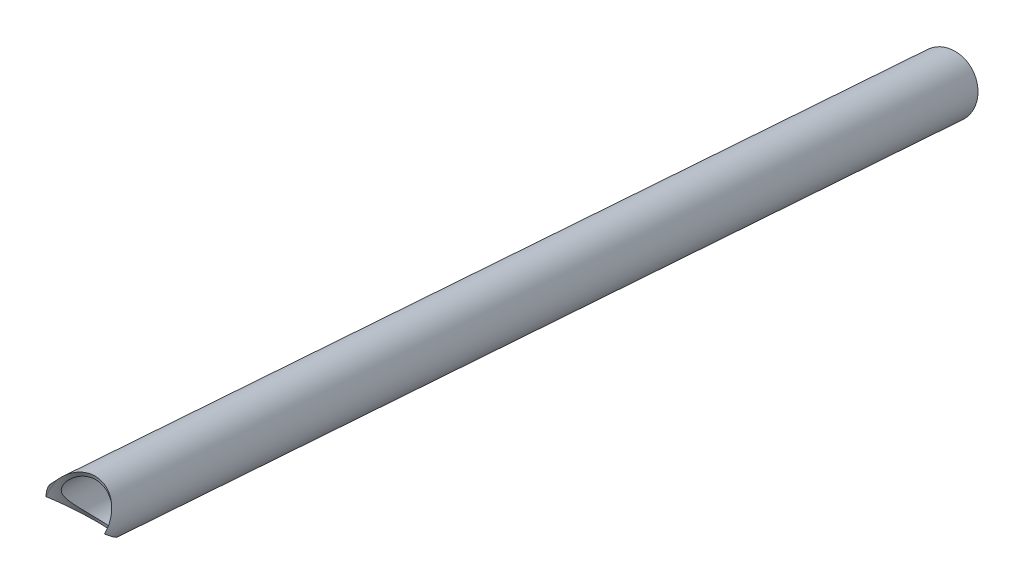
ISO-10303-21;
HEADER;
FILE_DESCRIPTION(('STEP AP214'),'2;1');
FILE_NAME('part.step','',(''),(''),'','','');
FILE_SCHEMA(('AUTOMOTIVE_DESIGN { 1 0 10303 214 1 1 1 1 }'));
ENDSEC;
DATA;
#1=APPLICATION_CONTEXT('core data for automotive mechanical design processes');
#2=APPLICATION_PROTOCOL_DEFINITION('international standard','automotive_design',2000,#1);
#3=PRODUCT_CONTEXT('',#1,'mechanical');
#4=PRODUCT('Part','Part','',(#3));
#5=PRODUCT_RELATED_PRODUCT_CATEGORY('part','',(#4));
#6=PRODUCT_DEFINITION_FORMATION('','',#4);
#7=PRODUCT_DEFINITION_CONTEXT('part definition',#1,'design');
#8=PRODUCT_DEFINITION('design','',#6,#7);
#9=PRODUCT_DEFINITION_SHAPE('','',#8);
#10=(LENGTH_UNIT() NAMED_UNIT(*) SI_UNIT(.MILLI.,.METRE.));
#11=(NAMED_UNIT(*) PLANE_ANGLE_UNIT() SI_UNIT($,.RADIAN.));
#12=(NAMED_UNIT(*) SI_UNIT($,.STERADIAN.) SOLID_ANGLE_UNIT());
#13=UNCERTAINTY_MEASURE_WITH_UNIT(LENGTH_MEASURE(1.E-05),#10,'distance_accuracy_value','');
#14=(GEOMETRIC_REPRESENTATION_CONTEXT(3) GLOBAL_UNCERTAINTY_ASSIGNED_CONTEXT((#13)) GLOBAL_UNIT_ASSIGNED_CONTEXT((#10,
#11,#12)) REPRESENTATION_CONTEXT('',''));
#15=CARTESIAN_POINT('',(0.,0.,0.));
#16=DIRECTION('',(0.,0.,1.));
#17=DIRECTION('',(1.,0.,0.));
#18=AXIS2_PLACEMENT_3D('',#15,#16,#17);
#19=CARTESIAN_POINT('',(250.,220.,-2000.));
#20=DIRECTION('',(0.171152156864514,0.228202875819352,0.958452078441276));
#21=DIRECTION('',(0.,-0.972806214685367,0.23162052730604));
#22=AXIS2_PLACEMENT_3D('',#19,#20,#21);
#23=CYLINDRICAL_SURFACE('',#22,9.39999999999998);
#24=CARTESIAN_POINT('',(250.,220.,-2000.));
#25=DIRECTION('',(-0.171152156864514,-0.228202875819352,-0.958452078441277));
#26=DIRECTION('',(0.885418864490996,0.391053351370442,-0.251218452318736));
#27=AXIS2_PLACEMENT_3D('',#24,#25,#26);
#28=CIRCLE('',#27,9.39999999999998);
#29=CARTESIAN_POINT('',(258.322937326216,223.675901502882,-2002.3614534518));
#30=VERTEX_POINT('',#29);
#31=EDGE_CURVE('E89',#30,#30,#28,.T.);
#32=ORIENTED_EDGE('',*,*,#31,.T.);
#33=EDGE_LOOP('',(#32));
#34=FACE_BOUND('',#33,.T.);
#35=CARTESIAN_POINT('',(321.601767600686,306.324645049538,-1596.85286847948));
#36=CARTESIAN_POINT('',(321.781080774417,306.327707101685,-1596.8400051246));
#37=CARTESIAN_POINT('',(321.959770351667,306.337374632281,-1596.82040478536));
#38=CARTESIAN_POINT('',(322.314337047943,306.368817564557,-1596.76899989526));
#39=CARTESIAN_POINT('',(322.490212352777,306.390600476499,-1596.73718777817));
#40=CARTESIAN_POINT('',(323.01277482856,306.472423462454,-1596.62531393626));
#41=CARTESIAN_POINT('',(323.353516382182,306.54891151243,-1596.52889007802));
#42=CARTESIAN_POINT('',(323.922788016049,306.709916408253,-1596.33462490514));
#43=CARTESIAN_POINT('',(324.156454577644,306.786472235114,-1596.24443142116));
#44=CARTESIAN_POINT('',(324.612687400611,306.954298488119,-1596.05028510563));
#45=CARTESIAN_POINT('',(324.835247481268,307.045576990401,-1595.94632472786));
#46=CARTESIAN_POINT('',(325.269375967195,307.240341377979,-1595.72741033868));
#47=CARTESIAN_POINT('',(325.480938995254,307.343833155784,-1595.61245102574));
#48=CARTESIAN_POINT('',(325.893614657707,307.56109064102,-1595.37369924162));
#49=CARTESIAN_POINT('',(326.094723416864,307.674860116051,-1595.24990353472));
#50=CARTESIAN_POINT('',(326.471419007699,307.901741067899,-1595.00537128265));
#51=CARTESIAN_POINT('',(326.647763387566,308.014184759307,-1594.88517495039));
#52=CARTESIAN_POINT('',(326.992589577548,308.245606729958,-1594.63984378319));
#53=CARTESIAN_POINT('',(327.161070002633,308.364586152328,-1594.51470808543));
#54=CARTESIAN_POINT('',(327.490718276294,308.60844717664,-1594.26032867711));
#55=CARTESIAN_POINT('',(327.651881025974,308.733332773907,-1594.13108220569));
#56=CARTESIAN_POINT('',(327.967208138273,308.9884106065,-1593.86931174218));
#57=CARTESIAN_POINT('',(328.121371683488,309.118603458284,-1593.73678737007));
#58=CARTESIAN_POINT('',(328.575459015843,309.517847043186,-1593.33396127361));
#59=CARTESIAN_POINT('',(328.865354808176,309.794346792712,-1593.05967967808));
#60=CARTESIAN_POINT('',(329.420740134314,310.364953287635,-1592.50539943498));
#61=CARTESIAN_POINT('',(329.686242317891,310.65905077523,-1592.22540384361));
#62=CARTESIAN_POINT('',(330.082618714562,311.131206599553,-1591.7875792771));
#63=CARTESIAN_POINT('',(330.221264664895,311.303293586178,-1591.63028359505));
#64=CARTESIAN_POINT('',(330.49165975499,311.653087738718,-1591.31598399416));
#65=CARTESIAN_POINT('',(330.623408692322,311.830795069348,-1591.15898008401));
#66=CARTESIAN_POINT('',(330.880236635939,312.192337883028,-1590.84596500389));
#67=CARTESIAN_POINT('',(331.00530677186,312.3761810136,-1590.68995538519));
#68=CARTESIAN_POINT('',(331.24852777896,312.750235849928,-1590.3801985613));
#69=CARTESIAN_POINT('',(331.366678966265,312.940447264092,-1590.22645125299));
#70=CARTESIAN_POINT('',(331.595061361597,313.326596366906,-1589.9235474909));
#71=CARTESIAN_POINT('',(331.705340809439,313.522486522434,-1589.77436698913));
#72=CARTESIAN_POINT('',(331.918418710713,313.922125656639,-1589.48112326473));
#73=CARTESIAN_POINT('',(332.021215599725,314.125876265201,-1589.33706111543));
#74=CARTESIAN_POINT('',(332.218280878936,314.541820873505,-1589.05656380588));
#75=CARTESIAN_POINT('',(332.31256800745,314.753994763335,-1588.92011215401));
#76=CARTESIAN_POINT('',(332.491546238881,315.188390568588,-1588.65740957291));
#77=CARTESIAN_POINT('',(332.576243185299,315.410606248575,-1588.53115244555));
#78=CARTESIAN_POINT('',(332.710812055198,315.799272726835,-1588.32773811021));
#79=CARTESIAN_POINT('',(332.763594029047,315.962872805198,-1588.24707150887));
#80=CARTESIAN_POINT('',(332.862402565381,316.296087435063,-1588.09433377974));
#81=CARTESIAN_POINT('',(332.908428642053,316.465702418003,-1588.02226327015));
#82=CARTESIAN_POINT('',(332.99233623619,316.810450175096,-1587.88879539948));
#83=CARTESIAN_POINT('',(333.030242634706,316.985564151193,-1587.82736554636));
#84=CARTESIAN_POINT('',(333.096611955169,317.341400907144,-1587.71682378567));
#85=CARTESIAN_POINT('',(333.125077539368,317.522122090052,-1587.66770840644));
#86=CARTESIAN_POINT('',(333.166981565684,317.856043003057,-1587.59081884477));
#87=CARTESIAN_POINT('',(333.182180372302,318.008507572878,-1587.56081217194));
#88=CARTESIAN_POINT('',(333.204296736112,318.31567306306,-1587.51086130483));
#89=CARTESIAN_POINT('',(333.211215299517,318.470373709379,-1587.49091588808));
#90=CARTESIAN_POINT('',(333.216136479499,318.780936253883,-1587.46122741269));
#91=CARTESIAN_POINT('',(333.214136728656,318.936798449446,-1587.45148706389));
#92=CARTESIAN_POINT('',(333.200831836324,319.248431867339,-1587.44184899067));
#93=CARTESIAN_POINT('',(333.189526142527,319.404203083721,-1587.44195185049));
#94=CARTESIAN_POINT('',(333.157575367502,319.71377108516,-1587.4511476295));
#95=CARTESIAN_POINT('',(333.136973704575,319.867573668888,-1587.46019898478));
#96=CARTESIAN_POINT('',(333.086573681942,320.172978930106,-1587.486085494));
#97=CARTESIAN_POINT('',(333.056775336243,320.324581610946,-1587.50292063607));
#98=CARTESIAN_POINT('',(332.988228842207,320.62506373752,-1587.54309735265));
#99=CARTESIAN_POINT('',(332.949469167338,320.773939407162,-1587.56644731494));
#100=CARTESIAN_POINT('',(332.86339834885,321.068291660555,-1587.61832184997));
#101=CARTESIAN_POINT('',(332.816084941237,321.21376733286,-1587.6468477927));
#102=CARTESIAN_POINT('',(332.68581812277,321.577822791337,-1587.72411867877));
#103=CARTESIAN_POINT('',(332.597339024818,321.793877619426,-1587.7755163383));
#104=CARTESIAN_POINT('',(332.402645179952,322.216510691972,-1587.88351133695));
#105=CARTESIAN_POINT('',(332.296422280019,322.423084524169,-1587.94011106095));
#106=CARTESIAN_POINT('',(332.067422255333,322.826606514682,-1588.05530292409));
#107=CARTESIAN_POINT('',(331.944624044808,323.023541969774,-1588.11389752877));
#108=CARTESIAN_POINT('',(331.683757594953,323.407188552992,-1588.23035366736));
#109=CARTESIAN_POINT('',(331.545691306572,323.593900982864,-1588.28821529388));
#110=CARTESIAN_POINT('',(331.251512721638,323.961572828597,-1588.40255105472));
#111=CARTESIAN_POINT('',(331.095022448238,324.142253426697,-1588.45894914041));
#112=CARTESIAN_POINT('',(330.768109578339,324.492114555506,-1588.56683285081));
#113=CARTESIAN_POINT('',(330.597686671571,324.661294829956,-1588.61831836607));
#114=CARTESIAN_POINT('',(330.244040459604,324.987551121087,-1588.71479146016));
#115=CARTESIAN_POINT('',(330.060822687063,325.144632308523,-1588.75978182209));
#116=CARTESIAN_POINT('',(329.682617393519,325.446151718743,-1588.8419907131));
#117=CARTESIAN_POINT('',(329.48762981803,325.590589882993,-1588.8792092062));
#118=CARTESIAN_POINT('',(329.066585662035,325.880218512429,-1588.9481422419));
#119=CARTESIAN_POINT('',(328.839388761684,326.023982753696,-1588.9789080582));
#120=CARTESIAN_POINT('',(328.373762418022,326.294404082152,-1589.02852580397));
#121=CARTESIAN_POINT('',(328.135332156539,326.42105992066,-1589.0473768642));
#122=CARTESIAN_POINT('',(327.649057755926,326.656333313446,-1589.07228617465));
#123=CARTESIAN_POINT('',(327.40121301208,326.764949706592,-1589.07834360168));
#124=CARTESIAN_POINT('',(326.898105095235,326.963261029327,-1589.07706619097));
#125=CARTESIAN_POINT('',(326.642842388517,327.052957145297,-1589.0697321932));
#126=CARTESIAN_POINT('',(326.139202366288,327.208898993227,-1589.04204099359));
#127=CARTESIAN_POINT('',(325.891071275868,327.276053951391,-1589.02231683871));
#128=CARTESIAN_POINT('',(325.391839235487,327.391997617288,-1588.97042329816));
#129=CARTESIAN_POINT('',(325.140738369855,327.440786845251,-1588.93825426506));
#130=CARTESIAN_POINT('',(324.637515505374,327.519621058031,-1588.8617016503));
#131=CARTESIAN_POINT('',(324.385393729015,327.549669926735,-1588.81732060229));
#132=CARTESIAN_POINT('',(323.881953634455,327.590828293967,-1588.71679885466));
#133=CARTESIAN_POINT('',(323.63063530907,327.60193796229,-1588.66065826047));
#134=CARTESIAN_POINT('',(323.137426907563,327.605120487825,-1588.53898239891));
#135=CARTESIAN_POINT('',(322.895466406192,327.597703307756,-1588.47374445895));
#136=CARTESIAN_POINT('',(322.415596766306,327.564975163565,-1588.33361182507));
#137=CARTESIAN_POINT('',(322.177687538261,327.539664595398,-1588.25871734487));
#138=CARTESIAN_POINT('',(321.70734874329,327.471328164719,-1588.10026588976));
#139=CARTESIAN_POINT('',(321.474919603323,327.428300926676,-1588.01670824261));
#140=CARTESIAN_POINT('',(321.016864397154,327.324784717241,-1587.84210974388));
#141=CARTESIAN_POINT('',(320.791238479925,327.264295363786,-1587.75106872861));
#142=CARTESIAN_POINT('',(320.340903330557,327.123949800354,-1587.55986390841));
#143=CARTESIAN_POINT('',(320.116450823753,327.043539490967,-1587.45950219148));
#144=CARTESIAN_POINT('',(319.677108323331,326.864752497413,-1587.25394635425));
#145=CARTESIAN_POINT('',(319.462218910534,326.766374723825,-1587.14875194122));
#146=CARTESIAN_POINT('',(319.042820280655,326.551864047697,-1586.93543682557));
#147=CARTESIAN_POINT('',(318.838317442881,326.435720405112,-1586.82731438561));
#148=CARTESIAN_POINT('',(318.44063366216,326.185917038127,-1586.6105199574));
#149=CARTESIAN_POINT('',(318.247451450657,326.052259281758,-1586.50184803222));
#150=CARTESIAN_POINT('',(317.894715096975,325.783974147958,-1586.29917066284));
#151=CARTESIAN_POINT('',(317.733855026036,325.651244723042,-1586.20492191267));
#152=CARTESIAN_POINT('',(317.421894364273,325.372121846324,-1586.02048920915));
#153=CARTESIAN_POINT('',(317.270794369957,325.225727560699,-1585.93030550435));
#154=CARTESIAN_POINT('',(316.978969044896,324.919484333276,-1585.75696492813));
#155=CARTESIAN_POINT('',(316.838230299868,324.759653383122,-1585.67379895001));
#156=CARTESIAN_POINT('',(316.567369715183,324.426513074735,-1585.51781893094));
#157=CARTESIAN_POINT('',(316.437243807402,324.253208931291,-1585.4450009154));
#158=CARTESIAN_POINT('',(316.222974601456,323.943984223852,-1585.33214471663));
#159=CARTESIAN_POINT('',(316.136155373751,323.811177376298,-1585.28863631888));
#160=CARTESIAN_POINT('',(315.968486568691,323.539284394313,-1585.21074957592));
#161=CARTESIAN_POINT('',(315.887635178935,323.400200187133,-1585.17636845051));
#162=CARTESIAN_POINT('',(315.732255584185,323.116714043955,-1585.11841918718));
#163=CARTESIAN_POINT('',(315.657714875058,322.972323477325,-1585.09482923837));
#164=CARTESIAN_POINT('',(315.514963552227,322.678991797392,-1585.05978596493));
#165=CARTESIAN_POINT('',(315.446752774343,322.530050802248,-1585.04833232544));
#166=CARTESIAN_POINT('',(315.316437950708,322.228172300512,-1585.03852758926));
#167=CARTESIAN_POINT('',(315.254367247284,322.07521813199,-1585.04024443661));
#168=CARTESIAN_POINT('',(315.1367203714,321.767592602222,-1585.05730835449));
#169=CARTESIAN_POINT('',(315.081144097674,321.612921267793,-1585.07265521245));
#170=CARTESIAN_POINT('',(314.976251369196,321.303191204807,-1585.11666605281));
#171=CARTESIAN_POINT('',(314.926941394994,321.14813224161,-1585.14534368133));
#172=CARTESIAN_POINT('',(314.834305969344,320.838998953635,-1585.21509256022));
#173=CARTESIAN_POINT('',(314.790982623863,320.684924993446,-1585.25616815583));
#174=CARTESIAN_POINT('',(314.69422596006,320.319492782565,-1585.36744568887));
#175=CARTESIAN_POINT('',(314.643358462888,320.109014264251,-1585.44276881418));
#176=CARTESIAN_POINT('',(314.551080989999,319.693042909714,-1585.61088792208));
#177=CARTESIAN_POINT('',(314.509676117628,319.487552816972,-1585.70369328413));
#178=CARTESIAN_POINT('',(314.435071278697,319.081219245343,-1585.90348962126));
#179=CARTESIAN_POINT('',(314.401900401074,318.88039444988,-1586.01052889325));
#180=CARTESIAN_POINT('',(314.343023037801,318.483919570225,-1586.23550472171));
#181=CARTESIAN_POINT('',(314.317315653983,318.288268865952,-1586.35343996468));
#182=CARTESIAN_POINT('',(314.270543193828,317.883320491345,-1586.60940508424));
#183=CARTESIAN_POINT('',(314.250147590914,317.674483346217,-1586.748280433));
#184=CARTESIAN_POINT('',(314.216808935535,317.261614385667,-1587.03390066336));
#185=CARTESIAN_POINT('',(314.203867818622,317.05758383145,-1587.180647578));
#186=CARTESIAN_POINT('',(314.185035392677,316.653499059911,-1587.48034632481));
#187=CARTESIAN_POINT('',(314.179151269424,316.453449099251,-1587.63330431788));
#188=CARTESIAN_POINT('',(314.174237334672,316.056977231248,-1587.94390466182));
#189=CARTESIAN_POINT('',(314.175206912802,315.860555002394,-1588.1015465943));
#190=CARTESIAN_POINT('',(314.18393390583,315.470368388598,-1588.42085788464));
#191=CARTESIAN_POINT('',(314.191707950534,315.276611697296,-1588.58253616605));
#192=CARTESIAN_POINT('',(314.214109203242,314.891862307098,-1588.90870443463));
#193=CARTESIAN_POINT('',(314.22873690319,314.700869807626,-1589.07319462283));
#194=CARTESIAN_POINT('',(314.264975878766,314.321509834388,-1589.40415947532));
#195=CARTESIAN_POINT('',(314.286582385542,314.133140659442,-1589.57063270993));
#196=CARTESIAN_POINT('',(314.337019813566,313.758704235288,-1589.90507020145));
#197=CARTESIAN_POINT('',(314.36585104754,313.57263708609,-1590.0730345226));
#198=CARTESIAN_POINT('',(314.457355312303,313.053413024784,-1590.54582932822));
#199=CARTESIAN_POINT('',(314.528565180776,312.722696666898,-1590.85175404074));
#200=CARTESIAN_POINT('',(314.698261072133,312.068229113148,-1591.46378527818));
#201=CARTESIAN_POINT('',(314.796757836771,311.744480714492,-1591.76989182722));
#202=CARTESIAN_POINT('',(315.024304618572,311.106387677854,-1592.37762835195));
#203=CARTESIAN_POINT('',(315.153208752351,310.792005972122,-1592.67927261108));
#204=CARTESIAN_POINT('',(315.373423683922,310.328174257826,-1593.12619808481));
#205=CARTESIAN_POINT('',(315.451274675874,310.174903660918,-1593.27420131359));
#206=CARTESIAN_POINT('',(315.61677477213,309.871301647731,-1593.56778241644));
#207=CARTESIAN_POINT('',(315.704424243597,309.72097034184,-1593.71336019938));
#208=CARTESIAN_POINT('',(315.882439028598,309.436594026317,-1593.9889245684));
#209=CARTESIAN_POINT('',(315.971926065648,309.302258344588,-1594.11917718086));
#210=CARTESIAN_POINT('',(316.160614352788,309.037145826187,-1594.37621097617));
#211=CARTESIAN_POINT('',(316.259814203794,308.906368480414,-1594.50299265563));
#212=CARTESIAN_POINT('',(316.468996099853,308.648866010235,-1594.7524153465));
#213=CARTESIAN_POINT('',(316.578998755614,308.522149268547,-1594.87504781817));
#214=CARTESIAN_POINT('',(316.810532098301,308.274026279511,-1595.11474730156));
#215=CARTESIAN_POINT('',(316.932063039462,308.152620149365,-1595.23181419046));
#216=CARTESIAN_POINT('',(317.189552978733,307.914536025414,-1595.46071357327));
#217=CARTESIAN_POINT('',(317.325708919384,307.797962493398,-1595.57243471352));
#218=CARTESIAN_POINT('',(317.611654735454,307.573283978483,-1595.78676871122));
#219=CARTESIAN_POINT('',(317.761446616644,307.465180245808,-1595.88938022429));
#220=CARTESIAN_POINT('',(318.07451314488,307.25991531557,-1596.08286188845));
#221=CARTESIAN_POINT('',(318.237736177605,307.162715334889,-1596.17377383494));
#222=CARTESIAN_POINT('',(318.577895843021,306.981228863873,-1596.34172036479));
#223=CARTESIAN_POINT('',(318.754821652254,306.896932334987,-1596.41876574426));
#224=CARTESIAN_POINT('',(319.055535220648,306.771159583838,-1596.53177262828));
#225=CARTESIAN_POINT('',(319.175648324544,306.72516285505,-1596.57256339293));
#226=CARTESIAN_POINT('',(319.420490502866,306.640080546884,-1596.64679656177));
#227=CARTESIAN_POINT('',(319.545218277959,306.60099303975,-1596.68024101632));
#228=CARTESIAN_POINT('',(319.798489277779,306.530255742392,-1596.73927094602));
#229=CARTESIAN_POINT('',(319.927029709499,306.498600651972,-1596.76486202558));
#230=CARTESIAN_POINT('',(320.18708463067,306.443051316009,-1596.80789229131));
#231=CARTESIAN_POINT('',(320.318598677346,306.419155923073,-1596.82533268284));
#232=CARTESIAN_POINT('',(320.640711221973,306.370730088015,-1596.85765010532));
#233=CARTESIAN_POINT('',(320.832396496074,306.350345787958,-1596.86819932062));
#234=CARTESIAN_POINT('',(321.216882387592,306.325664696883,-1596.8726967332));
#235=CARTESIAN_POINT('',(321.409682790001,306.321364901769,-1596.86664803085));
#236=CARTESIAN_POINT('',(321.601767600686,306.324645049538,-1596.85286847948));
#237=B_SPLINE_CURVE_WITH_KNOTS('',3,(#35,#36,#37,#38,#39,#40,#41,#42,#43,#44,#45,#46,#47,#48,
#49,#50,#51,#52,#53,#54,#55,#56,#57,#58,#59,#60,#61,#62,#63,#64,#65,#66,#67,#68,#69,#70,#71,#72,
#73,#74,#75,#76,#77,#78,#79,#80,#81,#82,#83,#84,#85,#86,#87,#88,#89,#90,#91,#92,#93,#94,#95,#96,
#97,#98,#99,#100,#101,#102,#103,#104,#105,#106,#107,#108,#109,#110,#111,#112,#113,#114,#115,
#116,#117,#118,#119,#120,#121,#122,#123,#124,#125,#126,#127,#128,#129,#130,#131,#132,#133,#134,
#135,#136,#137,#138,#139,#140,#141,#142,#143,#144,#145,#146,#147,#148,#149,#150,#151,#152,#153,
#154,#155,#156,#157,#158,#159,#160,#161,#162,#163,#164,#165,#166,#167,#168,#169,#170,#171,#172,
#173,#174,#175,#176,#177,#178,#179,#180,#181,#182,#183,#184,#185,#186,#187,#188,#189,#190,#191,
#192,#193,#194,#195,#196,#197,#198,#199,#200,#201,#202,#203,#204,#205,#206,#207,#208,#209,#210,
#211,#212,#213,#214,#215,#216,#217,#218,#219,#220,#221,#222,#223,#224,#225,#226,#227,#228,#229,
#230,#231,#232,#233,#234,#235,#236),.UNSPECIFIED.,.T.,.F.,(4,2,2,2,2,2,2,2,2,2,2,2,2,2,2,2,2,2,
2,2,2,2,2,2,2,2,2,2,2,2,2,2,2,2,2,2,2,2,2,2,2,2,2,2,2,2,2,2,2,2,2,2,2,2,2,2,2,2,2,2,2,2,2,2,2,2,
2,2,2,2,2,2,2,2,2,2,2,2,2,2,2,2,2,2,2,2,2,2,2,2,2,2,2,2,2,2,2,2,2,2,4),(0.,0.539132538618885,
1.07859965582011,2.16015174911402,2.94495358752151,3.73018740312591,4.51580162945702,
5.30170502412609,6.02508201439685,6.74858593170452,7.47258647788791,8.19667136044703,
9.65201030977914,11.10659025463,11.9202260052759,12.7338856232553,13.5486003064782,
14.3632777363619,15.1724350604512,15.981761076689,16.7892591248679,17.5962624690483,
18.1655962802229,18.7349710117246,19.3025752311456,19.8700192532411,20.3378939546983,
20.8057117942837,21.273653826264,21.7416236325751,22.2074299804735,22.6732356189147,
23.1396437674026,23.6061755455241,24.3222842186423,25.0387228430024,25.7560816066264,
26.4733488120904,27.2094048131341,27.9454772100145,28.6812332676442,29.4169927314648,
30.2278053991006,31.038677213115,31.8496011997017,32.6604743227342,33.4329552473639,
34.2054142889638,34.9777131873653,35.7500051619153,36.5012748381915,37.2525278904084,
38.003839281224,38.7551671116556,39.5303582519102,40.30559640994,41.0813050904938,
41.856926680596,42.542892557346,43.2289003187899,43.9140037187757,44.5988432577127,
45.091995764306,45.5849978815119,46.0769991016963,46.5689875571193,47.0635157880092,
47.5580363067931,48.0530641626276,48.548265717754,49.2348962811234,49.9218962861254,
50.6112898364398,51.3006003894926,52.0551379667126,52.809871370806,53.5653726309888,
54.320806609266,55.0780920051351,55.8354317661015,56.5922551025687,57.349111204101,
58.7165819316096,60.0845917441829,61.4461672475162,62.1265013025685,62.8068608592894,
63.4288450534207,64.05073978522,64.6738449766389,65.2969639127075,65.9298880329254,
66.5629054036532,67.1935946072127,67.8237906295406,68.2281833131783,68.6324629875914,
69.0364534808439,69.4403842104921,70.0180245240262,70.5955569465452),.UNSPECIFIED.);
#238=CARTESIAN_POINT('',(321.601767600686,306.324645049538,-1596.85286847948));
#239=VERTEX_POINT('',#238);
#240=EDGE_CURVE('E87',#239,#239,#237,.T.);
#241=ORIENTED_EDGE('',*,*,#240,.T.);
#242=EDGE_LOOP('',(#241));
#243=FACE_BOUND('',#242,.T.);
#244=ADVANCED_FACE('F41',(#34,#243),#23,.F.);
#245=CARTESIAN_POINT('',(250.,220.,-2000.));
#246=DIRECTION('',(0.171152156864514,0.228202875819352,0.958452078441276));
#247=DIRECTION('',(0.,-0.972806214685367,0.23162052730604));
#248=AXIS2_PLACEMENT_3D('',#245,#246,#247);
#249=CYLINDRICAL_SURFACE('',#248,11.);
#250=CARTESIAN_POINT('',(250.,220.,-2000.));
#251=DIRECTION('',(-0.171152156864514,-0.228202875819352,-0.958452078441277));
#252=DIRECTION('',(0.885418864490996,0.391053351370442,-0.251218452318736));
#253=AXIS2_PLACEMENT_3D('',#250,#251,#252);
#254=CIRCLE('',#253,11.);
#255=CARTESIAN_POINT('',(259.739607509401,224.301586865075,-2002.76340297551));
#256=VERTEX_POINT('',#255);
#257=EDGE_CURVE('E79',#256,#256,#254,.T.);
#258=ORIENTED_EDGE('',*,*,#257,.F.);
#259=EDGE_LOOP('',(#258));
#260=FACE_BOUND('',#259,.T.);
#261=CARTESIAN_POINT('',(325.,320.,-1580.));
#262=DIRECTION('',(-0.0201323161087032,-0.0822472927426935,0.996408587219418));
#263=DIRECTION('',(0.526991553913357,0.846050959333568,0.0804840127897104));
#264=AXIS2_PLACEMENT_3D('',#261,#262,#263);
#265=ELLIPSE('',#264,11.7925144812184,11.);
#266=CARTESIAN_POINT('',(314.891903689038,324.37489138664,-1579.84311297152));
#267=VERTEX_POINT('',#266);
#268=CARTESIAN_POINT('',(313.841284703454,320.540121803659,-1580.18087683098));
#269=VERTEX_POINT('',#268);
#270=EDGE_CURVE('E78',#267,#269,#265,.T.);
#271=ORIENTED_EDGE('',*,*,#270,.F.);
#272=CARTESIAN_POINT('',(325.,320.,-1580.));
#273=DIRECTION('',(0.0427126536783038,0.0629297921225689,0.997103540500768));
#274=DIRECTION('',(0.611440895819701,0.787641342485716,-0.0759022168747455));
#275=AXIS2_PLACEMENT_3D('',#272,#273,#274);
#276=ELLIPSE('',#275,11.2549576190536,11.);
#277=CARTESIAN_POINT('',(315.65955769277,325.814860529656,-1579.9668769473));
#278=VERTEX_POINT('',#277);
#279=EDGE_CURVE('E46',#278,#267,#276,.T.);
#280=ORIENTED_EDGE('',*,*,#279,.F.);
#281=CARTESIAN_POINT('',(325.,320.,-1580.));
#282=DIRECTION('',(0.526991553913357,0.846050959333568,0.0804840127897104));
#283=DIRECTION('',(-0.0201323161087032,-0.0822472927426935,0.996408587219418));
#284=AXIS2_PLACEMENT_3D('',#281,#282,#283);
#285=ELLIPSE('',#284,30.5210436776293,11.);
#286=CARTESIAN_POINT('',(315.751220700312,326.001625780894,-1582.53034941331));
#287=VERTEX_POINT('',#286);
#288=EDGE_CURVE('E69',#287,#278,#285,.T.);
#289=ORIENTED_EDGE('',*,*,#288,.F.);
#290=CARTESIAN_POINT('',(325.,320.,-1580.));
#291=DIRECTION('',(0.217268286027578,0.644059979147453,0.733472041148959));
#292=DIRECTION('',(-0.046806891515563,-0.743683273485426,0.666891523146495));
#293=AXIS2_PLACEMENT_3D('',#290,#291,#292);
#294=ELLIPSE('',#293,12.3991151975754,11.);
#295=CARTESIAN_POINT('',(335.724879319693,318.028514830938,-1581.44575579065));
#296=VERTEX_POINT('',#295);
#297=EDGE_CURVE('E11',#296,#287,#294,.T.);
#298=ORIENTED_EDGE('',*,*,#297,.F.);
#299=CARTESIAN_POINT('',(325.,320.,-1580.));
#300=DIRECTION('',(-0.046806891515563,-0.743683273485426,0.666891523146495));
#301=DIRECTION('',(0.217268286027578,0.644059979147453,0.733472041148959));
#302=AXIS2_PLACEMENT_3D('',#299,#300,#301);
#303=ELLIPSE('',#302,23.8372924851441,11.);
#304=EDGE_CURVE('E52',#269,#296,#303,.T.);
#305=ORIENTED_EDGE('',*,*,#304,.F.);
#306=EDGE_LOOP('',(#271,#280,#289,#298,#305));
#307=FACE_BOUND('',#306,.T.);
#308=ADVANCED_FACE('F85',(#260,#307),#249,.T.);
#309=CARTESIAN_POINT('',(325.,320.,-1580.));
#310=DIRECTION('',(0.0427126536783038,0.0629297921225689,0.997103540500768));
#311=DIRECTION('',(0.,-0.998014330188054,0.0629872744234134));
#312=AXIS2_PLACEMENT_3D('',#309,#310,#311);
#313=PLANE('',#312);
#314=ORIENTED_EDGE('',*,*,#279,.T.);
#315=CARTESIAN_POINT('',(325.,320.,-1580.));
#316=DIRECTION('',(0.0427126536783038,0.0629297921225689,0.997103540500768));
#317=DIRECTION('',(0.489400664257567,0.868759037548237,-0.0757939608577898));
#318=AXIS2_PLACEMENT_3D('',#315,#316,#317);
#319=ELLIPSE('',#318,12.7182524712078,11.);
#320=EDGE_CURVE('E73',#267,#278,#319,.F.);
#321=ORIENTED_EDGE('',*,*,#320,.T.);
#322=EDGE_LOOP('',(#314,#321));
#323=FACE_BOUND('',#322,.T.);
#324=ADVANCED_FACE('F83',(#323),#313,.T.);
#325=CARTESIAN_POINT('',(250.,220.,-2000.));
#326=DIRECTION('',(-0.171152156864514,-0.228202875819352,-0.958452078441277));
#327=DIRECTION('',(0.885418864490996,0.391053351370442,-0.251218452318736));
#328=AXIS2_PLACEMENT_3D('',#325,#326,#327);
#329=PLANE('',#328);
#330=ORIENTED_EDGE('',*,*,#31,.F.);
#331=EDGE_LOOP('',(#330));
#332=FACE_BOUND('',#331,.T.);
#333=ORIENTED_EDGE('',*,*,#257,.T.);
#334=EDGE_LOOP('',(#333));
#335=FACE_BOUND('',#334,.T.);
#336=ADVANCED_FACE('F105',(#332,#335),#329,.T.);
#337=CARTESIAN_POINT('',(150.,2.22044604925031E-13,-825.));
#338=DIRECTION('',(0.20871080944,0.381642622975999,-0.900438063583998));
#339=DIRECTION('',(0.,0.920714591276893,0.390236647958419));
#340=AXIS2_PLACEMENT_3D('',#337,#338,#339);
#341=CYLINDRICAL_SURFACE('',#340,11.);
#342=ORIENTED_EDGE('',*,*,#288,.T.);
#343=ORIENTED_EDGE('',*,*,#320,.F.);
#344=ORIENTED_EDGE('',*,*,#270,.T.);
#345=CARTESIAN_POINT('',(325.,320.,-1580.));
#346=DIRECTION('',(-0.00416950723616232,-0.393939167319851,-0.919127057408686));
#347=DIRECTION('',(0.2871987901008,0.87994037819309,-0.37844654284329));
#348=AXIS2_PLACEMENT_3D('',#345,#346,#347);
#349=ELLIPSE('',#348,16.2624994633842,11.);
#350=EDGE_CURVE('E75',#269,#287,#349,.T.);
#351=ORIENTED_EDGE('',*,*,#350,.T.);
#352=EDGE_LOOP('',(#342,#343,#344,#351));
#353=FACE_BOUND('',#352,.T.);
#354=ADVANCED_FACE('F71',(#353),#341,.F.);
#355=CARTESIAN_POINT('',(325.,320.,-1580.));
#356=DIRECTION('',(-0.214351342090107,-0.914565726251124,-0.342962147344171));
#357=DIRECTION('',(0.,0.351123441588391,-0.936329177569045));
#358=AXIS2_PLACEMENT_3D('',#355,#356,#357);
#359=CYLINDRICAL_SURFACE('',#358,11.);
#360=ORIENTED_EDGE('',*,*,#240,.F.);
#361=EDGE_LOOP('',(#360));
#362=FACE_BOUND('',#361,.T.);
#363=ORIENTED_EDGE('',*,*,#304,.T.);
#364=ORIENTED_EDGE('',*,*,#297,.T.);
#365=ORIENTED_EDGE('',*,*,#350,.F.);
#366=EDGE_LOOP('',(#363,#364,#365));
#367=FACE_BOUND('',#366,.T.);
#368=ADVANCED_FACE('F43',(#362,#367),#359,.F.);
#369=CLOSED_SHELL('',(#244,#308,#324,#336,#354,#368));
#370=MANIFOLD_SOLID_BREP('B2',#369);
#371=ADVANCED_BREP_SHAPE_REPRESENTATION('',(#18,#370),#14);
#372=SHAPE_DEFINITION_REPRESENTATION(#9,#371);
ENDSEC;
END-ISO-10303-21;
